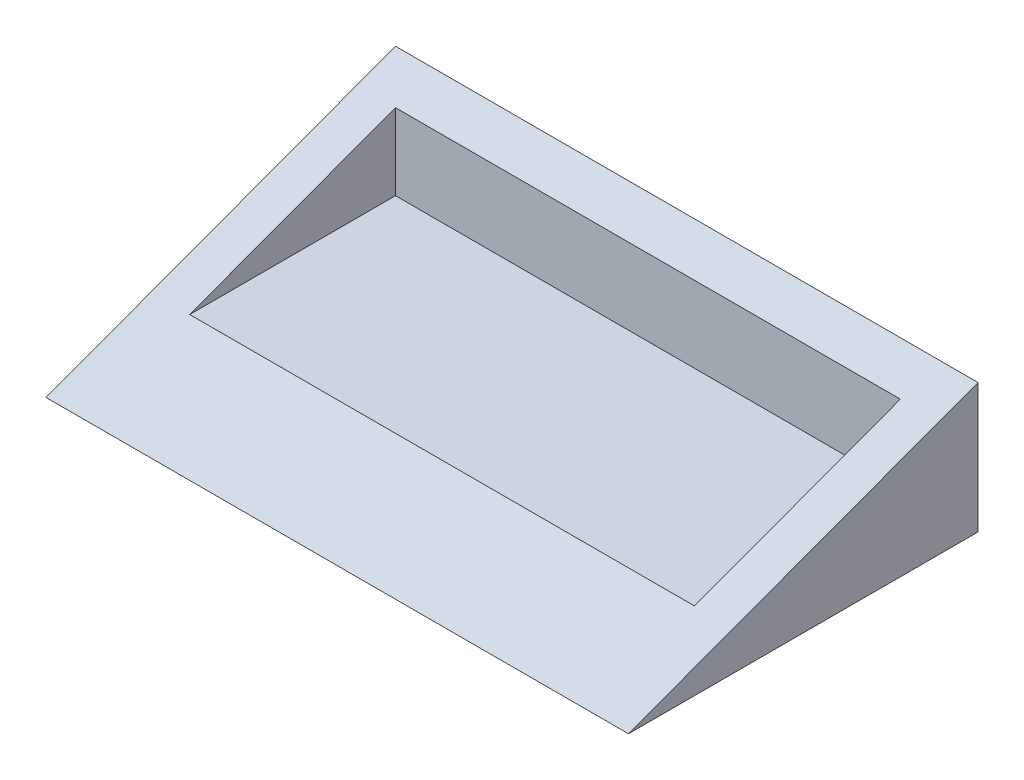
ISO-10303-21;
HEADER;
FILE_DESCRIPTION(('STEP AP214'),'2;1');
FILE_NAME('part.step','',(''),(''),'','','');
FILE_SCHEMA(('AUTOMOTIVE_DESIGN { 1 0 10303 214 1 1 1 1 }'));
ENDSEC;
DATA;
#1=APPLICATION_CONTEXT('core data for automotive mechanical design processes');
#2=APPLICATION_PROTOCOL_DEFINITION('international standard','automotive_design',2000,#1);
#3=PRODUCT_CONTEXT('',#1,'mechanical');
#4=PRODUCT('Part','Part','',(#3));
#5=PRODUCT_RELATED_PRODUCT_CATEGORY('part','',(#4));
#6=PRODUCT_DEFINITION_FORMATION('','',#4);
#7=PRODUCT_DEFINITION_CONTEXT('part definition',#1,'design');
#8=PRODUCT_DEFINITION('design','',#6,#7);
#9=PRODUCT_DEFINITION_SHAPE('','',#8);
#10=(LENGTH_UNIT() NAMED_UNIT(*) SI_UNIT(.MILLI.,.METRE.));
#11=(NAMED_UNIT(*) PLANE_ANGLE_UNIT() SI_UNIT($,.RADIAN.));
#12=(NAMED_UNIT(*) SI_UNIT($,.STERADIAN.) SOLID_ANGLE_UNIT());
#13=UNCERTAINTY_MEASURE_WITH_UNIT(LENGTH_MEASURE(1.E-05),#10,'distance_accuracy_value','');
#14=(GEOMETRIC_REPRESENTATION_CONTEXT(3) GLOBAL_UNCERTAINTY_ASSIGNED_CONTEXT((#13)) GLOBAL_UNIT_ASSIGNED_CONTEXT((#10,
#11,#12)) REPRESENTATION_CONTEXT('',''));
#15=CARTESIAN_POINT('',(0.,0.,0.));
#16=DIRECTION('',(0.,0.,1.));
#17=DIRECTION('',(1.,0.,0.));
#18=AXIS2_PLACEMENT_3D('',#15,#16,#17);
#19=CARTESIAN_POINT('',(45.,0.,0.));
#20=DIRECTION('',(0.,-0.937748760723704,-0.347314355823594));
#21=DIRECTION('',(0.,0.347314355823594,-0.937748760723704));
#22=AXIS2_PLACEMENT_3D('',#19,#20,#21);
#23=PLANE('',#22);
#24=DIRECTION('',(0.,-0.347314355823594,0.937748760723704));
#25=VECTOR('',#24,1.);
#26=CARTESIAN_POINT('',(0.,0.,0.));
#27=LINE('',#26,#25);
#28=CARTESIAN_POINT('',(0.,10.,-27.));
#29=VERTEX_POINT('',#28);
#30=CARTESIAN_POINT('',(0.,0.,0.));
#31=VERTEX_POINT('',#30);
#32=EDGE_CURVE('E80',#29,#31,#27,.T.);
#33=ORIENTED_EDGE('',*,*,#32,.T.);
#34=DIRECTION('',(-1.,0.,0.));
#35=VECTOR('',#34,1.);
#36=CARTESIAN_POINT('',(45.,0.,0.));
#37=LINE('',#36,#35);
#38=CARTESIAN_POINT('',(45.,0.,0.));
#39=VERTEX_POINT('',#38);
#40=EDGE_CURVE('E149',#39,#31,#37,.T.);
#41=ORIENTED_EDGE('',*,*,#40,.F.);
#42=DIRECTION('',(0.,-0.347314355823594,0.937748760723704));
#43=VECTOR('',#42,1.);
#44=CARTESIAN_POINT('',(45.,0.,0.));
#45=LINE('',#44,#43);
#46=CARTESIAN_POINT('',(45.,10.,-27.));
#47=VERTEX_POINT('',#46);
#48=EDGE_CURVE('E63',#47,#39,#45,.T.);
#49=ORIENTED_EDGE('',*,*,#48,.F.);
#50=DIRECTION('',(-1.,0.,0.));
#51=VECTOR('',#50,1.);
#52=CARTESIAN_POINT('',(45.,10.,-27.));
#53=LINE('',#52,#51);
#54=EDGE_CURVE('E47',#47,#29,#53,.T.);
#55=ORIENTED_EDGE('',*,*,#54,.T.);
#56=EDGE_LOOP('',(#33,#41,#49,#55));
#57=FACE_BOUND('',#56,.T.);
#58=DIRECTION('',(0.,-0.347314355823594,0.937748760723704));
#59=VECTOR('',#58,1.);
#60=CARTESIAN_POINT('',(3.,0.,0.));
#61=LINE('',#60,#59);
#62=CARTESIAN_POINT('',(3.,8.88888888888889,-24.));
#63=VERTEX_POINT('',#62);
#64=CARTESIAN_POINT('',(3.,3.,-8.1));
#65=VERTEX_POINT('',#64);
#66=EDGE_CURVE('E112',#63,#65,#61,.T.);
#67=ORIENTED_EDGE('',*,*,#66,.F.);
#68=DIRECTION('',(-1.,0.,0.));
#69=VECTOR('',#68,1.);
#70=CARTESIAN_POINT('',(45.,8.88888888888889,-24.));
#71=LINE('',#70,#69);
#72=CARTESIAN_POINT('',(42.,8.88888888888889,-24.));
#73=VERTEX_POINT('',#72);
#74=EDGE_CURVE('E107',#73,#63,#71,.T.);
#75=ORIENTED_EDGE('',*,*,#74,.F.);
#76=DIRECTION('',(0.,-0.347314355823594,0.937748760723704));
#77=VECTOR('',#76,1.);
#78=CARTESIAN_POINT('',(42.,0.,0.));
#79=LINE('',#78,#77);
#80=CARTESIAN_POINT('',(42.,3.,-8.1));
#81=VERTEX_POINT('',#80);
#82=EDGE_CURVE('E54',#73,#81,#79,.T.);
#83=ORIENTED_EDGE('',*,*,#82,.T.);
#84=DIRECTION('',(-1.,0.,0.));
#85=VECTOR('',#84,1.);
#86=CARTESIAN_POINT('',(45.,3.,-8.1));
#87=LINE('',#86,#85);
#88=EDGE_CURVE('E133',#81,#65,#87,.T.);
#89=ORIENTED_EDGE('',*,*,#88,.T.);
#90=EDGE_LOOP('',(#67,#75,#83,#89));
#91=FACE_BOUND('',#90,.T.);
#92=ADVANCED_FACE('F38',(#57,#91),#23,.F.);
#93=CARTESIAN_POINT('',(45.,0.,-27.));
#94=DIRECTION('',(0.,1.,0.));
#95=DIRECTION('',(0.,0.,1.));
#96=AXIS2_PLACEMENT_3D('',#93,#94,#95);
#97=PLANE('',#96);
#98=DIRECTION('',(0.,0.,-1.));
#99=VECTOR('',#98,1.);
#100=CARTESIAN_POINT('',(0.,0.,-27.));
#101=LINE('',#100,#99);
#102=CARTESIAN_POINT('',(0.,0.,-27.));
#103=VERTEX_POINT('',#102);
#104=EDGE_CURVE('E122',#31,#103,#101,.T.);
#105=ORIENTED_EDGE('',*,*,#104,.T.);
#106=DIRECTION('',(-1.,0.,0.));
#107=VECTOR('',#106,1.);
#108=CARTESIAN_POINT('',(45.,0.,-27.));
#109=LINE('',#108,#107);
#110=CARTESIAN_POINT('',(45.,0.,-27.));
#111=VERTEX_POINT('',#110);
#112=EDGE_CURVE('E11',#111,#103,#109,.T.);
#113=ORIENTED_EDGE('',*,*,#112,.F.);
#114=DIRECTION('',(0.,0.,-1.));
#115=VECTOR('',#114,1.);
#116=CARTESIAN_POINT('',(45.,0.,-27.));
#117=LINE('',#116,#115);
#118=EDGE_CURVE('E142',#39,#111,#117,.T.);
#119=ORIENTED_EDGE('',*,*,#118,.F.);
#120=ORIENTED_EDGE('',*,*,#40,.T.);
#121=EDGE_LOOP('',(#105,#113,#119,#120));
#122=FACE_BOUND('',#121,.T.);
#123=ADVANCED_FACE('F40',(#122),#97,.F.);
#124=CARTESIAN_POINT('',(45.,10.,-27.));
#125=DIRECTION('',(0.,0.,1.));
#126=DIRECTION('',(1.,0.,0.));
#127=AXIS2_PLACEMENT_3D('',#124,#125,#126);
#128=PLANE('',#127);
#129=DIRECTION('',(0.,1.,0.));
#130=VECTOR('',#129,1.);
#131=CARTESIAN_POINT('',(0.,10.,-27.));
#132=LINE('',#131,#130);
#133=EDGE_CURVE('E153',#103,#29,#132,.T.);
#134=ORIENTED_EDGE('',*,*,#133,.T.);
#135=ORIENTED_EDGE('',*,*,#54,.F.);
#136=DIRECTION('',(0.,1.,0.));
#137=VECTOR('',#136,1.);
#138=CARTESIAN_POINT('',(45.,10.,-27.));
#139=LINE('',#138,#137);
#140=EDGE_CURVE('E85',#111,#47,#139,.T.);
#141=ORIENTED_EDGE('',*,*,#140,.F.);
#142=ORIENTED_EDGE('',*,*,#112,.T.);
#143=EDGE_LOOP('',(#134,#135,#141,#142));
#144=FACE_BOUND('',#143,.T.);
#145=ADVANCED_FACE('F169',(#144),#128,.F.);
#146=CARTESIAN_POINT('',(45.,0.,0.));
#147=DIRECTION('',(1.,0.,0.));
#148=DIRECTION('',(0.,0.,-1.));
#149=AXIS2_PLACEMENT_3D('',#146,#147,#148);
#150=PLANE('',#149);
#151=ORIENTED_EDGE('',*,*,#118,.T.);
#152=ORIENTED_EDGE('',*,*,#140,.T.);
#153=ORIENTED_EDGE('',*,*,#48,.T.);
#154=EDGE_LOOP('',(#151,#152,#153));
#155=FACE_BOUND('',#154,.T.);
#156=ADVANCED_FACE('F167',(#155),#150,.T.);
#157=CARTESIAN_POINT('',(0.,0.,0.));
#158=DIRECTION('',(1.,0.,0.));
#159=DIRECTION('',(0.,0.,-1.));
#160=AXIS2_PLACEMENT_3D('',#157,#158,#159);
#161=PLANE('',#160);
#162=ORIENTED_EDGE('',*,*,#104,.F.);
#163=ORIENTED_EDGE('',*,*,#32,.F.);
#164=ORIENTED_EDGE('',*,*,#133,.F.);
#165=EDGE_LOOP('',(#162,#163,#164));
#166=FACE_BOUND('',#165,.T.);
#167=ADVANCED_FACE('F163',(#166),#161,.F.);
#168=CARTESIAN_POINT('',(45.,3.,-27.));
#169=DIRECTION('',(0.,1.,0.));
#170=DIRECTION('',(0.,0.,1.));
#171=AXIS2_PLACEMENT_3D('',#168,#169,#170);
#172=PLANE('',#171);
#173=DIRECTION('',(0.,0.,-1.));
#174=VECTOR('',#173,1.);
#175=CARTESIAN_POINT('',(3.,3.,-27.));
#176=LINE('',#175,#174);
#177=CARTESIAN_POINT('',(3.,3.,-24.));
#178=VERTEX_POINT('',#177);
#179=EDGE_CURVE('E113',#65,#178,#176,.T.);
#180=ORIENTED_EDGE('',*,*,#179,.F.);
#181=ORIENTED_EDGE('',*,*,#88,.F.);
#182=DIRECTION('',(0.,0.,-1.));
#183=VECTOR('',#182,1.);
#184=CARTESIAN_POINT('',(42.,3.,-27.));
#185=LINE('',#184,#183);
#186=CARTESIAN_POINT('',(42.,3.,-24.));
#187=VERTEX_POINT('',#186);
#188=EDGE_CURVE('E120',#81,#187,#185,.T.);
#189=ORIENTED_EDGE('',*,*,#188,.T.);
#190=DIRECTION('',(-1.,0.,0.));
#191=VECTOR('',#190,1.);
#192=CARTESIAN_POINT('',(45.,3.,-24.));
#193=LINE('',#192,#191);
#194=EDGE_CURVE('E105',#187,#178,#193,.T.);
#195=ORIENTED_EDGE('',*,*,#194,.T.);
#196=EDGE_LOOP('',(#180,#181,#189,#195));
#197=FACE_BOUND('',#196,.T.);
#198=ADVANCED_FACE('F118',(#197),#172,.T.);
#199=CARTESIAN_POINT('',(45.,10.,-24.));
#200=DIRECTION('',(0.,0.,1.));
#201=DIRECTION('',(1.,0.,0.));
#202=AXIS2_PLACEMENT_3D('',#199,#200,#201);
#203=PLANE('',#202);
#204=DIRECTION('',(0.,1.,0.));
#205=VECTOR('',#204,1.);
#206=CARTESIAN_POINT('',(3.,10.,-24.));
#207=LINE('',#206,#205);
#208=EDGE_CURVE('E102',#178,#63,#207,.T.);
#209=ORIENTED_EDGE('',*,*,#208,.F.);
#210=ORIENTED_EDGE('',*,*,#194,.F.);
#211=DIRECTION('',(0.,1.,0.));
#212=VECTOR('',#211,1.);
#213=CARTESIAN_POINT('',(42.,10.,-24.));
#214=LINE('',#213,#212);
#215=EDGE_CURVE('E129',#187,#73,#214,.T.);
#216=ORIENTED_EDGE('',*,*,#215,.T.);
#217=ORIENTED_EDGE('',*,*,#74,.T.);
#218=EDGE_LOOP('',(#209,#210,#216,#217));
#219=FACE_BOUND('',#218,.T.);
#220=ADVANCED_FACE('F104',(#219),#203,.T.);
#221=CARTESIAN_POINT('',(42.,0.,0.));
#222=DIRECTION('',(1.,0.,0.));
#223=DIRECTION('',(0.,0.,-1.));
#224=AXIS2_PLACEMENT_3D('',#221,#222,#223);
#225=PLANE('',#224);
#226=ORIENTED_EDGE('',*,*,#188,.F.);
#227=ORIENTED_EDGE('',*,*,#82,.F.);
#228=ORIENTED_EDGE('',*,*,#215,.F.);
#229=EDGE_LOOP('',(#226,#227,#228));
#230=FACE_BOUND('',#229,.T.);
#231=ADVANCED_FACE('F218',(#230),#225,.F.);
#232=CARTESIAN_POINT('',(3.,0.,0.));
#233=DIRECTION('',(1.,0.,0.));
#234=DIRECTION('',(0.,0.,-1.));
#235=AXIS2_PLACEMENT_3D('',#232,#233,#234);
#236=PLANE('',#235);
#237=ORIENTED_EDGE('',*,*,#179,.T.);
#238=ORIENTED_EDGE('',*,*,#208,.T.);
#239=ORIENTED_EDGE('',*,*,#66,.T.);
#240=EDGE_LOOP('',(#237,#238,#239));
#241=FACE_BOUND('',#240,.T.);
#242=ADVANCED_FACE('F124',(#241),#236,.T.);
#243=CLOSED_SHELL('',(#92,#123,#145,#156,#167,#198,#220,#231,#242));
#244=MANIFOLD_SOLID_BREP('B2',#243);
#245=ADVANCED_BREP_SHAPE_REPRESENTATION('',(#18,#244),#14);
#246=SHAPE_DEFINITION_REPRESENTATION(#9,#245);
ENDSEC;
END-ISO-10303-21;
